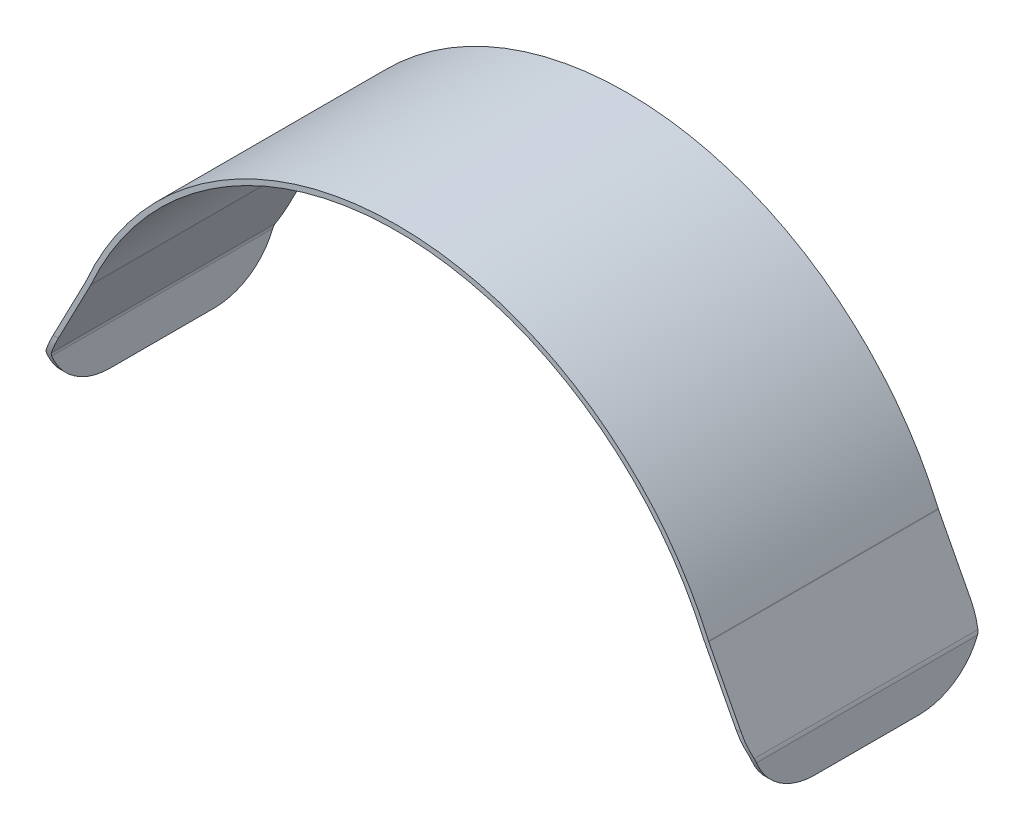
ISO-10303-21;
HEADER;
FILE_DESCRIPTION(('STEP AP214'),'2;1');
FILE_NAME('part.step','',(''),(''),'','','');
FILE_SCHEMA(('AUTOMOTIVE_DESIGN { 1 0 10303 214 1 1 1 1 }'));
ENDSEC;
DATA;
#1=APPLICATION_CONTEXT('core data for automotive mechanical design processes');
#2=APPLICATION_PROTOCOL_DEFINITION('international standard','automotive_design',2000,#1);
#3=PRODUCT_CONTEXT('',#1,'mechanical');
#4=PRODUCT('Part','Part','',(#3));
#5=PRODUCT_RELATED_PRODUCT_CATEGORY('part','',(#4));
#6=PRODUCT_DEFINITION_FORMATION('','',#4);
#7=PRODUCT_DEFINITION_CONTEXT('part definition',#1,'design');
#8=PRODUCT_DEFINITION('design','',#6,#7);
#9=PRODUCT_DEFINITION_SHAPE('','',#8);
#10=(LENGTH_UNIT() NAMED_UNIT(*) SI_UNIT(.MILLI.,.METRE.));
#11=(NAMED_UNIT(*) PLANE_ANGLE_UNIT() SI_UNIT($,.RADIAN.));
#12=(NAMED_UNIT(*) SI_UNIT($,.STERADIAN.) SOLID_ANGLE_UNIT());
#13=UNCERTAINTY_MEASURE_WITH_UNIT(LENGTH_MEASURE(1.E-05),#10,'distance_accuracy_value','');
#14=(GEOMETRIC_REPRESENTATION_CONTEXT(3) GLOBAL_UNCERTAINTY_ASSIGNED_CONTEXT((#13)) GLOBAL_UNIT_ASSIGNED_CONTEXT((#10,
#11,#12)) REPRESENTATION_CONTEXT('',''));
#15=CARTESIAN_POINT('',(0.,0.,0.));
#16=DIRECTION('',(0.,0.,1.));
#17=DIRECTION('',(1.,0.,0.));
#18=AXIS2_PLACEMENT_3D('',#15,#16,#17);
#19=CARTESIAN_POINT('',(-212.725,0.,69.85));
#20=DIRECTION('',(-1.,0.,0.));
#21=DIRECTION('',(0.,0.,1.));
#22=AXIS2_PLACEMENT_3D('',#19,#20,#21);
#23=PLANE('',#22);
#24=CARTESIAN_POINT('',(-212.725,38.1,-31.75));
#25=DIRECTION('',(-1.,0.,0.));
#26=DIRECTION('',(0.,0.,1.));
#27=AXIS2_PLACEMENT_3D('',#24,#25,#26);
#28=CIRCLE('',#27,38.1);
#29=CARTESIAN_POINT('',(-212.725,0.,-31.75));
#30=VERTEX_POINT('',#29);
#31=CARTESIAN_POINT('',(-212.725,24.1569319083965,-67.2070282481895));
#32=VERTEX_POINT('',#31);
#33=EDGE_CURVE('E266',#30,#32,#28,.F.);
#34=ORIENTED_EDGE('',*,*,#33,.T.);
#35=DIRECTION('',(0.,0.,-1.));
#36=VECTOR('',#35,1.);
#37=CARTESIAN_POINT('',(-212.725,24.1569319083965,67.6710244842766));
#38=LINE('',#37,#36);
#39=CARTESIAN_POINT('',(-212.725,24.1569319083965,67.2070282481895));
#40=VERTEX_POINT('',#39);
#41=EDGE_CURVE('E391',#32,#40,#38,.F.);
#42=ORIENTED_EDGE('',*,*,#41,.T.);
#43=CARTESIAN_POINT('',(-212.725,38.1,31.75));
#44=DIRECTION('',(-1.,0.,0.));
#45=DIRECTION('',(0.,0.,1.));
#46=AXIS2_PLACEMENT_3D('',#43,#44,#45);
#47=CIRCLE('',#46,38.1);
#48=CARTESIAN_POINT('',(-212.725,0.,31.75));
#49=VERTEX_POINT('',#48);
#50=EDGE_CURVE('E253',#40,#49,#47,.F.);
#51=ORIENTED_EDGE('',*,*,#50,.T.);
#52=DIRECTION('',(0.,0.,-1.));
#53=VECTOR('',#52,1.);
#54=CARTESIAN_POINT('',(-212.725,0.,69.85));
#55=LINE('',#54,#53);
#56=EDGE_CURVE('E435',#49,#30,#55,.T.);
#57=ORIENTED_EDGE('',*,*,#56,.T.);
#58=EDGE_LOOP('',(#34,#42,#51,#57));
#59=FACE_BOUND('',#58,.T.);
#60=ADVANCED_FACE('F33',(#59),#23,.F.);
#61=CARTESIAN_POINT('',(-212.725,25.4,69.85));
#62=DIRECTION('',(-0.887010833178223,0.461748613235032,0.));
#63=DIRECTION('',(-0.461748613235032,-0.887010833178223,0.));
#64=AXIS2_PLACEMENT_3D('',#61,#62,#63);
#65=PLANE('',#64);
#66=DIRECTION('',(0.461748613235032,0.887010833178223,0.));
#67=VECTOR('',#66,1.);
#68=CARTESIAN_POINT('',(-212.725,25.4,-69.85));
#69=LINE('',#68,#67);
#70=CARTESIAN_POINT('',(-206.113798457993,38.1,-69.85));
#71=VERTEX_POINT('',#70);
#72=CARTESIAN_POINT('',(-186.35550377433,76.0553309467451,-69.85));
#73=VERTEX_POINT('',#72);
#74=EDGE_CURVE('E414',#71,#73,#69,.T.);
#75=ORIENTED_EDGE('',*,*,#74,.T.);
#76=DIRECTION('',(0.,0.,-1.));
#77=VECTOR('',#76,1.);
#78=CARTESIAN_POINT('',(-186.35550377433,76.0553309467451,69.85));
#79=LINE('',#78,#77);
#80=CARTESIAN_POINT('',(-186.35550377433,76.0553309467451,69.85));
#81=VERTEX_POINT('',#80);
#82=EDGE_CURVE('E461',#73,#81,#79,.F.);
#83=ORIENTED_EDGE('',*,*,#82,.T.);
#84=DIRECTION('',(0.461748613235032,0.887010833178223,0.));
#85=VECTOR('',#84,1.);
#86=CARTESIAN_POINT('',(-212.725,25.4,69.85));
#87=LINE('',#86,#85);
#88=CARTESIAN_POINT('',(-206.113798457993,38.1,69.85));
#89=VERTEX_POINT('',#88);
#90=EDGE_CURVE('E434',#89,#81,#87,.T.);
#91=ORIENTED_EDGE('',*,*,#90,.F.);
#92=CARTESIAN_POINT('',(-206.113798457993,38.1,31.75));
#93=DIRECTION('',(-0.887010833178223,0.461748613235032,0.));
#94=DIRECTION('',(0.461748613235032,0.887010833178223,0.));
#95=AXIS2_PLACEMENT_3D('',#92,#93,#94);
#96=ELLIPSE('',#95,42.9532521756076,38.1);
#97=CARTESIAN_POINT('',(-212.151015032545,26.5026148636304,68.0420192053117));
#98=VERTEX_POINT('',#97);
#99=EDGE_CURVE('E250',#89,#98,#96,.F.);
#100=ORIENTED_EDGE('',*,*,#99,.T.);
#101=DIRECTION('',(0.,0.,-1.));
#102=VECTOR('',#101,1.);
#103=CARTESIAN_POINT('',(-212.151015032545,26.5026148636305,-67.6710244842766));
#104=LINE('',#103,#102);
#105=CARTESIAN_POINT('',(-212.151015032545,26.5026148636305,-68.0420192053117));
#106=VERTEX_POINT('',#105);
#107=EDGE_CURVE('E310',#98,#106,#104,.T.);
#108=ORIENTED_EDGE('',*,*,#107,.T.);
#109=CARTESIAN_POINT('',(-206.113798457993,38.1,-31.75));
#110=DIRECTION('',(-0.887010833178223,0.461748613235032,0.));
#111=DIRECTION('',(-0.461748613235032,-0.887010833178223,0.));
#112=AXIS2_PLACEMENT_3D('',#109,#110,#111);
#113=ELLIPSE('',#112,42.9532521756076,38.1);
#114=EDGE_CURVE('E269',#106,#71,#113,.F.);
#115=ORIENTED_EDGE('',*,*,#114,.T.);
#116=EDGE_LOOP('',(#75,#83,#91,#100,#108,#115));
#117=FACE_BOUND('',#116,.T.);
#118=ADVANCED_FACE('F401',(#117),#65,.F.);
#119=CARTESIAN_POINT('',(0.,-5.9570461695976,69.85));
#120=DIRECTION('',(0.,0.,-1.));
#121=DIRECTION('',(-1.,0.,0.));
#122=AXIS2_PLACEMENT_3D('',#119,#120,#121);
#123=CYLINDRICAL_SURFACE('',#122,203.592953830407);
#124=CARTESIAN_POINT('',(0.,-5.9570461695976,-69.85));
#125=DIRECTION('',(0.,0.,-1.));
#126=DIRECTION('',(-1.,0.,0.));
#127=AXIS2_PLACEMENT_3D('',#124,#125,#126);
#128=CIRCLE('',#127,203.592953830407);
#129=CARTESIAN_POINT('',(-186.215125981446,76.3473747633301,-69.85));
#130=VERTEX_POINT('',#129);
#131=CARTESIAN_POINT('',(186.215125981446,76.3473747633299,-69.85));
#132=VERTEX_POINT('',#131);
#133=EDGE_CURVE('E418',#130,#132,#128,.T.);
#134=ORIENTED_EDGE('',*,*,#133,.T.);
#135=DIRECTION('',(0.,0.,-1.));
#136=VECTOR('',#135,1.);
#137=CARTESIAN_POINT('',(186.215125981446,76.34737476333,69.85));
#138=LINE('',#137,#136);
#139=CARTESIAN_POINT('',(186.215125981446,76.3473747633299,69.85));
#140=VERTEX_POINT('',#139);
#141=EDGE_CURVE('E482',#132,#140,#138,.F.);
#142=ORIENTED_EDGE('',*,*,#141,.T.);
#143=CARTESIAN_POINT('',(0.,-5.9570461695976,69.85));
#144=DIRECTION('',(0.,0.,-1.));
#145=DIRECTION('',(-1.,0.,0.));
#146=AXIS2_PLACEMENT_3D('',#143,#144,#145);
#147=CIRCLE('',#146,203.592953830407);
#148=CARTESIAN_POINT('',(-186.215125981446,76.3473747633301,69.85));
#149=VERTEX_POINT('',#148);
#150=EDGE_CURVE('E551',#149,#140,#147,.T.);
#151=ORIENTED_EDGE('',*,*,#150,.F.);
#152=DIRECTION('',(0.,0.,-1.));
#153=VECTOR('',#152,1.);
#154=CARTESIAN_POINT('',(-186.215125981446,76.3473747633301,69.85));
#155=LINE('',#154,#153);
#156=EDGE_CURVE('E484',#149,#130,#155,.T.);
#157=ORIENTED_EDGE('',*,*,#156,.T.);
#158=EDGE_LOOP('',(#134,#142,#151,#157));
#159=FACE_BOUND('',#158,.T.);
#160=ADVANCED_FACE('F518',(#159),#123,.F.);
#161=CARTESIAN_POINT('',(212.725,25.4,69.85));
#162=DIRECTION('',(0.887010833178223,0.461748613235032,0.));
#163=DIRECTION('',(-0.461748613235032,0.887010833178223,0.));
#164=AXIS2_PLACEMENT_3D('',#161,#162,#163);
#165=PLANE('',#164);
#166=DIRECTION('',(0.461748613235032,-0.887010833178223,0.));
#167=VECTOR('',#166,1.);
#168=CARTESIAN_POINT('',(212.725,25.4,69.85));
#169=LINE('',#168,#167);
#170=CARTESIAN_POINT('',(186.355503774331,76.0553309467449,69.85));
#171=VERTEX_POINT('',#170);
#172=CARTESIAN_POINT('',(206.113798457993,38.1,69.85));
#173=VERTEX_POINT('',#172);
#174=EDGE_CURVE('E556',#171,#173,#169,.T.);
#175=ORIENTED_EDGE('',*,*,#174,.F.);
#176=DIRECTION('',(0.,0.,-1.));
#177=VECTOR('',#176,1.);
#178=CARTESIAN_POINT('',(186.355503774331,76.0553309467449,69.85));
#179=LINE('',#178,#177);
#180=CARTESIAN_POINT('',(186.355503774331,76.0553309467449,-69.85));
#181=VERTEX_POINT('',#180);
#182=EDGE_CURVE('E489',#171,#181,#179,.T.);
#183=ORIENTED_EDGE('',*,*,#182,.T.);
#184=DIRECTION('',(0.461748613235032,-0.887010833178223,0.));
#185=VECTOR('',#184,1.);
#186=CARTESIAN_POINT('',(212.725,25.4,-69.85));
#187=LINE('',#186,#185);
#188=CARTESIAN_POINT('',(206.113798457993,38.1,-69.85));
#189=VERTEX_POINT('',#188);
#190=EDGE_CURVE('E421',#181,#189,#187,.T.);
#191=ORIENTED_EDGE('',*,*,#190,.T.);
#192=CARTESIAN_POINT('',(206.113798457993,38.1,-31.75));
#193=DIRECTION('',(0.887010833178223,0.461748613235032,0.));
#194=DIRECTION('',(-0.461748613235032,0.887010833178223,0.));
#195=AXIS2_PLACEMENT_3D('',#192,#193,#194);
#196=ELLIPSE('',#195,42.9532521756076,38.1);
#197=CARTESIAN_POINT('',(212.151015032545,26.5026148636304,-68.0420192053117));
#198=VERTEX_POINT('',#197);
#199=EDGE_CURVE('E227',#189,#198,#196,.F.);
#200=ORIENTED_EDGE('',*,*,#199,.T.);
#201=DIRECTION('',(0.,0.,-1.));
#202=VECTOR('',#201,1.);
#203=CARTESIAN_POINT('',(212.151015032545,26.5026148636305,67.6710244842766));
#204=LINE('',#203,#202);
#205=CARTESIAN_POINT('',(212.151015032545,26.5026148636305,68.0420192053117));
#206=VERTEX_POINT('',#205);
#207=EDGE_CURVE('E385',#198,#206,#204,.F.);
#208=ORIENTED_EDGE('',*,*,#207,.T.);
#209=CARTESIAN_POINT('',(206.113798457993,38.1,31.75));
#210=DIRECTION('',(0.887010833178223,0.461748613235032,0.));
#211=DIRECTION('',(0.461748613235032,-0.887010833178223,0.));
#212=AXIS2_PLACEMENT_3D('',#209,#210,#211);
#213=ELLIPSE('',#212,42.9532521756076,38.1);
#214=EDGE_CURVE('E244',#206,#173,#213,.F.);
#215=ORIENTED_EDGE('',*,*,#214,.T.);
#216=EDGE_LOOP('',(#175,#183,#191,#200,#208,#215));
#217=FACE_BOUND('',#216,.T.);
#218=ADVANCED_FACE('F501',(#217),#165,.F.);
#219=CARTESIAN_POINT('',(212.725,0.,69.85));
#220=DIRECTION('',(1.,0.,0.));
#221=DIRECTION('',(0.,0.,-1.));
#222=AXIS2_PLACEMENT_3D('',#219,#220,#221);
#223=PLANE('',#222);
#224=CARTESIAN_POINT('',(212.725,38.1,31.75));
#225=DIRECTION('',(1.,0.,0.));
#226=DIRECTION('',(0.,0.,-1.));
#227=AXIS2_PLACEMENT_3D('',#224,#225,#226);
#228=CIRCLE('',#227,38.1);
#229=CARTESIAN_POINT('',(212.725,0.,31.75));
#230=VERTEX_POINT('',#229);
#231=CARTESIAN_POINT('',(212.725,24.1569319083965,67.2070282481895));
#232=VERTEX_POINT('',#231);
#233=EDGE_CURVE('E241',#230,#232,#228,.F.);
#234=ORIENTED_EDGE('',*,*,#233,.T.);
#235=DIRECTION('',(0.,0.,-1.));
#236=VECTOR('',#235,1.);
#237=CARTESIAN_POINT('',(212.725,24.1569319083965,-67.6710244842766));
#238=LINE('',#237,#236);
#239=CARTESIAN_POINT('',(212.725,24.1569319083965,-67.2070282481895));
#240=VERTEX_POINT('',#239);
#241=EDGE_CURVE('E386',#232,#240,#238,.T.);
#242=ORIENTED_EDGE('',*,*,#241,.T.);
#243=CARTESIAN_POINT('',(212.725,38.1,-31.75));
#244=DIRECTION('',(1.,0.,0.));
#245=DIRECTION('',(0.,0.,-1.));
#246=AXIS2_PLACEMENT_3D('',#243,#244,#245);
#247=CIRCLE('',#246,38.1);
#248=CARTESIAN_POINT('',(212.725,0.,-31.75));
#249=VERTEX_POINT('',#248);
#250=EDGE_CURVE('E230',#240,#249,#247,.F.);
#251=ORIENTED_EDGE('',*,*,#250,.T.);
#252=DIRECTION('',(0.,0.,-1.));
#253=VECTOR('',#252,1.);
#254=CARTESIAN_POINT('',(212.725,0.,69.85));
#255=LINE('',#254,#253);
#256=EDGE_CURVE('E205',#230,#249,#255,.T.);
#257=ORIENTED_EDGE('',*,*,#256,.F.);
#258=EDGE_LOOP('',(#234,#242,#251,#257));
#259=FACE_BOUND('',#258,.T.);
#260=ADVANCED_FACE('F498',(#259),#223,.F.);
#261=CARTESIAN_POINT('',(212.725,0.,69.85));
#262=DIRECTION('',(0.,1.,0.));
#263=DIRECTION('',(0.,0.,1.));
#264=AXIS2_PLACEMENT_3D('',#261,#262,#263);
#265=PLANE('',#264);
#266=DIRECTION('',(0.,0.,-1.));
#267=VECTOR('',#266,1.);
#268=CARTESIAN_POINT('',(215.9,0.,69.85));
#269=LINE('',#268,#267);
#270=CARTESIAN_POINT('',(215.9,0.,31.75));
#271=VERTEX_POINT('',#270);
#272=CARTESIAN_POINT('',(215.9,0.,-31.75));
#273=VERTEX_POINT('',#272);
#274=EDGE_CURVE('E195',#271,#273,#269,.T.);
#275=ORIENTED_EDGE('',*,*,#274,.F.);
#276=DIRECTION('',(1.,0.,0.));
#277=VECTOR('',#276,1.);
#278=CARTESIAN_POINT('',(212.725,0.,31.75));
#279=LINE('',#278,#277);
#280=EDGE_CURVE('E239',#271,#230,#279,.F.);
#281=ORIENTED_EDGE('',*,*,#280,.T.);
#282=ORIENTED_EDGE('',*,*,#256,.T.);
#283=DIRECTION('',(1.,0.,0.));
#284=VECTOR('',#283,1.);
#285=CARTESIAN_POINT('',(215.9,0.,-31.75));
#286=LINE('',#285,#284);
#287=EDGE_CURVE('E213',#249,#273,#286,.T.);
#288=ORIENTED_EDGE('',*,*,#287,.T.);
#289=EDGE_LOOP('',(#275,#281,#282,#288));
#290=FACE_BOUND('',#289,.T.);
#291=ADVANCED_FACE('F218',(#290),#265,.F.);
#292=CARTESIAN_POINT('',(215.9,0.,69.85));
#293=DIRECTION('',(-1.,0.,0.));
#294=DIRECTION('',(0.,0.,1.));
#295=AXIS2_PLACEMENT_3D('',#292,#293,#294);
#296=PLANE('',#295);
#297=CARTESIAN_POINT('',(215.9,38.1,-31.75));
#298=DIRECTION('',(-1.,0.,0.));
#299=DIRECTION('',(0.,0.,1.));
#300=AXIS2_PLACEMENT_3D('',#297,#298,#299);
#301=CIRCLE('',#300,38.1);
#302=CARTESIAN_POINT('',(215.9,24.1569319083965,-67.2070282481895));
#303=VERTEX_POINT('',#302);
#304=EDGE_CURVE('E198',#273,#303,#301,.F.);
#305=ORIENTED_EDGE('',*,*,#304,.T.);
#306=DIRECTION('',(0.,0.,-1.));
#307=VECTOR('',#306,1.);
#308=CARTESIAN_POINT('',(215.9,24.1569319083965,69.85));
#309=LINE('',#308,#307);
#310=CARTESIAN_POINT('',(215.9,24.1569319083965,67.2070282481895));
#311=VERTEX_POINT('',#310);
#312=EDGE_CURVE('E363',#303,#311,#309,.F.);
#313=ORIENTED_EDGE('',*,*,#312,.T.);
#314=CARTESIAN_POINT('',(215.9,38.1,31.75));
#315=DIRECTION('',(-1.,0.,0.));
#316=DIRECTION('',(0.,0.,1.));
#317=AXIS2_PLACEMENT_3D('',#314,#315,#316);
#318=CIRCLE('',#317,38.1);
#319=EDGE_CURVE('E201',#311,#271,#318,.F.);
#320=ORIENTED_EDGE('',*,*,#319,.T.);
#321=ORIENTED_EDGE('',*,*,#274,.T.);
#322=EDGE_LOOP('',(#305,#313,#320,#321));
#323=FACE_BOUND('',#322,.T.);
#324=ADVANCED_FACE('F197',(#323),#296,.F.);
#325=CARTESIAN_POINT('',(215.9,25.4,69.85));
#326=DIRECTION('',(-0.887010833178223,-0.461748613235032,0.));
#327=DIRECTION('',(0.461748613235032,-0.887010833178223,0.));
#328=AXIS2_PLACEMENT_3D('',#325,#326,#327);
#329=PLANE('',#328);
#330=DIRECTION('',(-0.461748613235032,0.887010833178223,0.));
#331=VECTOR('',#330,1.);
#332=CARTESIAN_POINT('',(215.9,25.4,-69.85));
#333=LINE('',#332,#331);
#334=CARTESIAN_POINT('',(209.288798457993,38.1,-69.85));
#335=VERTEX_POINT('',#334);
#336=CARTESIAN_POINT('',(189.540040041054,76.0370119488119,-69.85));
#337=VERTEX_POINT('',#336);
#338=EDGE_CURVE('E428',#335,#337,#333,.T.);
#339=ORIENTED_EDGE('',*,*,#338,.T.);
#340=DIRECTION('',(0.,0.,1.));
#341=VECTOR('',#340,1.);
#342=CARTESIAN_POINT('',(189.540040041054,76.0370119488119,69.85));
#343=LINE('',#342,#341);
#344=CARTESIAN_POINT('',(189.540040041054,76.0370119488119,69.85));
#345=VERTEX_POINT('',#344);
#346=EDGE_CURVE('E462',#337,#345,#343,.T.);
#347=ORIENTED_EDGE('',*,*,#346,.T.);
#348=DIRECTION('',(-0.461748613235032,0.887010833178223,0.));
#349=VECTOR('',#348,1.);
#350=CARTESIAN_POINT('',(215.9,25.4,69.85));
#351=LINE('',#350,#349);
#352=CARTESIAN_POINT('',(209.288798457993,38.1,69.85));
#353=VERTEX_POINT('',#352);
#354=EDGE_CURVE('E563',#353,#345,#351,.T.);
#355=ORIENTED_EDGE('',*,*,#354,.F.);
#356=CARTESIAN_POINT('',(209.288798457993,38.1,31.75));
#357=DIRECTION('',(-0.887010833178223,-0.461748613235032,0.));
#358=DIRECTION('',(0.461748613235032,-0.887010833178223,0.));
#359=AXIS2_PLACEMENT_3D('',#356,#357,#358);
#360=ELLIPSE('',#359,42.9532521756076,38.1);
#361=CARTESIAN_POINT('',(215.326015032545,26.5026148636305,68.0420192053117));
#362=VERTEX_POINT('',#361);
#363=EDGE_CURVE('E235',#353,#362,#360,.F.);
#364=ORIENTED_EDGE('',*,*,#363,.T.);
#365=DIRECTION('',(0.,0.,-1.));
#366=VECTOR('',#365,1.);
#367=CARTESIAN_POINT('',(215.326015032545,26.5026148636305,69.85));
#368=LINE('',#367,#366);
#369=CARTESIAN_POINT('',(215.326015032545,26.5026148636305,-68.0420192053117));
#370=VERTEX_POINT('',#369);
#371=EDGE_CURVE('E364',#362,#370,#368,.T.);
#372=ORIENTED_EDGE('',*,*,#371,.T.);
#373=CARTESIAN_POINT('',(209.288798457993,38.1,-31.75));
#374=DIRECTION('',(-0.887010833178223,-0.461748613235032,0.));
#375=DIRECTION('',(-0.461748613235032,0.887010833178223,0.));
#376=AXIS2_PLACEMENT_3D('',#373,#374,#375);
#377=ELLIPSE('',#376,42.9532521756076,38.1);
#378=EDGE_CURVE('E215',#370,#335,#377,.F.);
#379=ORIENTED_EDGE('',*,*,#378,.T.);
#380=EDGE_LOOP('',(#339,#347,#355,#364,#372,#379));
#381=FACE_BOUND('',#380,.T.);
#382=ADVANCED_FACE('F503',(#381),#329,.F.);
#383=CARTESIAN_POINT('',(0.,-5.5159289830972,69.85));
#384=DIRECTION('',(0.,0.,-1.));
#385=DIRECTION('',(-1.,0.,0.));
#386=AXIS2_PLACEMENT_3D('',#383,#384,#385);
#387=CYLINDRICAL_SURFACE('',#386,206.326836643904);
#388=CARTESIAN_POINT('',(0.,-5.5159289830972,69.85));
#389=DIRECTION('',(0.,0.,1.));
#390=DIRECTION('',(-1.,0.,0.));
#391=AXIS2_PLACEMENT_3D('',#388,#389,#390);
#392=CIRCLE('',#391,206.326836643904);
#393=CARTESIAN_POINT('',(189.38322592662,76.3666531519781,69.85));
#394=VERTEX_POINT('',#393);
#395=CARTESIAN_POINT('',(-189.38322592662,76.3666531519781,69.85));
#396=VERTEX_POINT('',#395);
#397=EDGE_CURVE('E564',#394,#396,#392,.T.);
#398=ORIENTED_EDGE('',*,*,#397,.F.);
#399=DIRECTION('',(0.,0.,-1.));
#400=VECTOR('',#399,1.);
#401=CARTESIAN_POINT('',(189.38322592662,76.3666531519781,69.85));
#402=LINE('',#401,#400);
#403=CARTESIAN_POINT('',(189.38322592662,76.3666531519781,-69.85));
#404=VERTEX_POINT('',#403);
#405=EDGE_CURVE('E466',#394,#404,#402,.T.);
#406=ORIENTED_EDGE('',*,*,#405,.T.);
#407=CARTESIAN_POINT('',(0.,-5.5159289830972,-69.85));
#408=DIRECTION('',(0.,0.,1.));
#409=DIRECTION('',(-1.,0.,0.));
#410=AXIS2_PLACEMENT_3D('',#407,#408,#409);
#411=CIRCLE('',#410,206.326836643904);
#412=CARTESIAN_POINT('',(-189.38322592662,76.3666531519781,-69.85));
#413=VERTEX_POINT('',#412);
#414=EDGE_CURVE('E431',#404,#413,#411,.T.);
#415=ORIENTED_EDGE('',*,*,#414,.T.);
#416=DIRECTION('',(0.,0.,-1.));
#417=VECTOR('',#416,1.);
#418=CARTESIAN_POINT('',(-189.38322592662,76.3666531519781,69.85));
#419=LINE('',#418,#417);
#420=EDGE_CURVE('E48',#413,#396,#419,.F.);
#421=ORIENTED_EDGE('',*,*,#420,.T.);
#422=EDGE_LOOP('',(#398,#406,#415,#421));
#423=FACE_BOUND('',#422,.T.);
#424=ADVANCED_FACE('F473',(#423),#387,.T.);
#425=CARTESIAN_POINT('',(-215.9,25.4,69.85));
#426=DIRECTION('',(0.887010833178223,-0.461748613235032,0.));
#427=DIRECTION('',(0.461748613235032,0.887010833178223,0.));
#428=AXIS2_PLACEMENT_3D('',#425,#426,#427);
#429=PLANE('',#428);
#430=DIRECTION('',(-0.461748613235032,-0.887010833178223,0.));
#431=VECTOR('',#430,1.);
#432=CARTESIAN_POINT('',(-215.9,25.4,69.85));
#433=LINE('',#432,#431);
#434=CARTESIAN_POINT('',(-189.540040041054,76.0370119488119,69.85));
#435=VERTEX_POINT('',#434);
#436=CARTESIAN_POINT('',(-209.288798457993,38.1,69.85));
#437=VERTEX_POINT('',#436);
#438=EDGE_CURVE('E424',#435,#437,#433,.T.);
#439=ORIENTED_EDGE('',*,*,#438,.F.);
#440=DIRECTION('',(0.,0.,1.));
#441=VECTOR('',#440,1.);
#442=CARTESIAN_POINT('',(-189.540040041054,76.0370119488119,-69.85));
#443=LINE('',#442,#441);
#444=CARTESIAN_POINT('',(-189.540040041054,76.0370119488119,-69.85));
#445=VERTEX_POINT('',#444);
#446=EDGE_CURVE('E458',#435,#445,#443,.F.);
#447=ORIENTED_EDGE('',*,*,#446,.T.);
#448=DIRECTION('',(-0.461748613235032,-0.887010833178223,0.));
#449=VECTOR('',#448,1.);
#450=CARTESIAN_POINT('',(-215.9,25.4,-69.85));
#451=LINE('',#450,#449);
#452=CARTESIAN_POINT('',(-209.288798457993,38.1,-69.85));
#453=VERTEX_POINT('',#452);
#454=EDGE_CURVE('E413',#445,#453,#451,.T.);
#455=ORIENTED_EDGE('',*,*,#454,.T.);
#456=CARTESIAN_POINT('',(-209.288798457993,38.1,-31.75));
#457=DIRECTION('',(0.887010833178223,-0.461748613235032,0.));
#458=DIRECTION('',(-0.461748613235032,-0.887010833178223,0.));
#459=AXIS2_PLACEMENT_3D('',#456,#457,#458);
#460=ELLIPSE('',#459,42.9532521756076,38.1);
#461=CARTESIAN_POINT('',(-215.326015032545,26.5026148636305,-68.0420192053117));
#462=VERTEX_POINT('',#461);
#463=EDGE_CURVE('E274',#453,#462,#460,.F.);
#464=ORIENTED_EDGE('',*,*,#463,.T.);
#465=DIRECTION('',(0.,0.,-1.));
#466=VECTOR('',#465,1.);
#467=CARTESIAN_POINT('',(-215.326015032545,26.5026148636305,69.85));
#468=LINE('',#467,#466);
#469=CARTESIAN_POINT('',(-215.326015032545,26.5026148636305,68.0420192053117));
#470=VERTEX_POINT('',#469);
#471=EDGE_CURVE('E290',#462,#470,#468,.F.);
#472=ORIENTED_EDGE('',*,*,#471,.T.);
#473=CARTESIAN_POINT('',(-209.288798457993,38.1,31.75));
#474=DIRECTION('',(0.887010833178223,-0.461748613235032,0.));
#475=DIRECTION('',(0.461748613235032,0.887010833178223,0.));
#476=AXIS2_PLACEMENT_3D('',#473,#474,#475);
#477=ELLIPSE('',#476,42.9532521756076,38.1);
#478=EDGE_CURVE('E260',#470,#437,#477,.F.);
#479=ORIENTED_EDGE('',*,*,#478,.T.);
#480=EDGE_LOOP('',(#439,#447,#455,#464,#472,#479));
#481=FACE_BOUND('',#480,.T.);
#482=ADVANCED_FACE('F455',(#481),#429,.F.);
#483=CARTESIAN_POINT('',(-215.9,0.,69.85));
#484=DIRECTION('',(1.,0.,0.));
#485=DIRECTION('',(0.,0.,-1.));
#486=AXIS2_PLACEMENT_3D('',#483,#484,#485);
#487=PLANE('',#486);
#488=CARTESIAN_POINT('',(-215.9,38.1,31.75));
#489=DIRECTION('',(1.,0.,0.));
#490=DIRECTION('',(0.,0.,-1.));
#491=AXIS2_PLACEMENT_3D('',#488,#489,#490);
#492=CIRCLE('',#491,38.1);
#493=CARTESIAN_POINT('',(-215.9,0.,31.75));
#494=VERTEX_POINT('',#493);
#495=CARTESIAN_POINT('',(-215.9,24.1569319083965,67.2070282481895));
#496=VERTEX_POINT('',#495);
#497=EDGE_CURVE('E257',#494,#496,#492,.F.);
#498=ORIENTED_EDGE('',*,*,#497,.T.);
#499=DIRECTION('',(0.,0.,-1.));
#500=VECTOR('',#499,1.);
#501=CARTESIAN_POINT('',(-215.9,24.1569319083965,69.85));
#502=LINE('',#501,#500);
#503=CARTESIAN_POINT('',(-215.9,24.1569319083965,-67.2070282481895));
#504=VERTEX_POINT('',#503);
#505=EDGE_CURVE('E279',#496,#504,#502,.T.);
#506=ORIENTED_EDGE('',*,*,#505,.T.);
#507=CARTESIAN_POINT('',(-215.9,38.1,-31.75));
#508=DIRECTION('',(1.,0.,0.));
#509=DIRECTION('',(0.,0.,-1.));
#510=AXIS2_PLACEMENT_3D('',#507,#508,#509);
#511=CIRCLE('',#510,38.1);
#512=CARTESIAN_POINT('',(-215.9,0.,-31.75));
#513=VERTEX_POINT('',#512);
#514=EDGE_CURVE('E277',#504,#513,#511,.F.);
#515=ORIENTED_EDGE('',*,*,#514,.T.);
#516=DIRECTION('',(0.,0.,-1.));
#517=VECTOR('',#516,1.);
#518=CARTESIAN_POINT('',(-215.9,0.,69.85));
#519=LINE('',#518,#517);
#520=EDGE_CURVE('E206',#494,#513,#519,.T.);
#521=ORIENTED_EDGE('',*,*,#520,.F.);
#522=EDGE_LOOP('',(#498,#506,#515,#521));
#523=FACE_BOUND('',#522,.T.);
#524=ADVANCED_FACE('F451',(#523),#487,.F.);
#525=CARTESIAN_POINT('',(-212.725,0.,69.85));
#526=DIRECTION('',(0.,1.,0.));
#527=DIRECTION('',(0.,0.,1.));
#528=AXIS2_PLACEMENT_3D('',#525,#526,#527);
#529=PLANE('',#528);
#530=ORIENTED_EDGE('',*,*,#520,.T.);
#531=DIRECTION('',(1.,0.,0.));
#532=VECTOR('',#531,1.);
#533=CARTESIAN_POINT('',(-212.725,0.,-31.75));
#534=LINE('',#533,#532);
#535=EDGE_CURVE('E263',#513,#30,#534,.T.);
#536=ORIENTED_EDGE('',*,*,#535,.T.);
#537=ORIENTED_EDGE('',*,*,#56,.F.);
#538=DIRECTION('',(1.,0.,0.));
#539=VECTOR('',#538,1.);
#540=CARTESIAN_POINT('',(-212.725,0.,31.75));
#541=LINE('',#540,#539);
#542=EDGE_CURVE('E255',#49,#494,#541,.F.);
#543=ORIENTED_EDGE('',*,*,#542,.T.);
#544=EDGE_LOOP('',(#530,#536,#537,#543));
#545=FACE_BOUND('',#544,.T.);
#546=ADVANCED_FACE('F442',(#545),#529,.F.);
#547=CARTESIAN_POINT('',(0.,-5.9570461695976,69.85));
#548=DIRECTION('',(0.,0.,-1.));
#549=DIRECTION('',(-1.,0.,0.));
#550=AXIS2_PLACEMENT_3D('',#547,#548,#549);
#551=PLANE('',#550);
#552=ORIENTED_EDGE('',*,*,#150,.T.);
#553=CARTESIAN_POINT('',(190.861518806876,78.4010139019789,69.85));
#554=DIRECTION('',(0.,0.,-1.));
#555=DIRECTION('',(-1.,0.,0.));
#556=AXIS2_PLACEMENT_3D('',#553,#554,#555);
#557=CIRCLE('',#556,5.08);
#558=EDGE_CURVE('E476',#140,#171,#557,.F.);
#559=ORIENTED_EDGE('',*,*,#558,.T.);
#560=ORIENTED_EDGE('',*,*,#174,.T.);
#561=DIRECTION('',(1.,0.,0.));
#562=VECTOR('',#561,1.);
#563=CARTESIAN_POINT('',(0.,38.1,69.85));
#564=LINE('',#563,#562);
#565=EDGE_CURVE('E232',#173,#353,#564,.T.);
#566=ORIENTED_EDGE('',*,*,#565,.T.);
#567=ORIENTED_EDGE('',*,*,#354,.T.);
#568=CARTESIAN_POINT('',(194.046055073599,78.3826949040459,69.85));
#569=DIRECTION('',(0.,0.,-1.));
#570=DIRECTION('',(-1.,0.,0.));
#571=AXIS2_PLACEMENT_3D('',#568,#569,#570);
#572=CIRCLE('',#571,5.08);
#573=EDGE_CURVE('E55',#345,#394,#572,.T.);
#574=ORIENTED_EDGE('',*,*,#573,.T.);
#575=ORIENTED_EDGE('',*,*,#397,.T.);
#576=CARTESIAN_POINT('',(-194.046055073599,78.3826949040459,69.85));
#577=DIRECTION('',(0.,0.,-1.));
#578=DIRECTION('',(-1.,0.,0.));
#579=AXIS2_PLACEMENT_3D('',#576,#577,#578);
#580=CIRCLE('',#579,5.08);
#581=EDGE_CURVE('E11',#396,#435,#580,.T.);
#582=ORIENTED_EDGE('',*,*,#581,.T.);
#583=ORIENTED_EDGE('',*,*,#438,.T.);
#584=DIRECTION('',(1.,0.,0.));
#585=VECTOR('',#584,1.);
#586=CARTESIAN_POINT('',(0.,38.1,69.85));
#587=LINE('',#586,#585);
#588=EDGE_CURVE('E247',#437,#89,#587,.T.);
#589=ORIENTED_EDGE('',*,*,#588,.T.);
#590=ORIENTED_EDGE('',*,*,#90,.T.);
#591=CARTESIAN_POINT('',(-190.861518806876,78.4010139019791,69.85));
#592=DIRECTION('',(0.,0.,-1.));
#593=DIRECTION('',(-1.,0.,0.));
#594=AXIS2_PLACEMENT_3D('',#591,#592,#593);
#595=CIRCLE('',#594,5.08);
#596=EDGE_CURVE('E478',#81,#149,#595,.F.);
#597=ORIENTED_EDGE('',*,*,#596,.T.);
#598=EDGE_LOOP('',(#552,#559,#560,#566,#567,#574,#575,#582,#583,#589,#590,#597));
#599=FACE_BOUND('',#598,.T.);
#600=ADVANCED_FACE('F543',(#599),#551,.F.);
#601=CARTESIAN_POINT('',(0.,-5.9570461695976,-69.85));
#602=DIRECTION('',(0.,0.,-1.));
#603=DIRECTION('',(-1.,0.,0.));
#604=AXIS2_PLACEMENT_3D('',#601,#602,#603);
#605=PLANE('',#604);
#606=ORIENTED_EDGE('',*,*,#190,.F.);
#607=CARTESIAN_POINT('',(190.861518806876,78.4010139019789,-69.85));
#608=DIRECTION('',(0.,0.,-1.));
#609=DIRECTION('',(-1.,0.,0.));
#610=AXIS2_PLACEMENT_3D('',#607,#608,#609);
#611=CIRCLE('',#610,5.08);
#612=EDGE_CURVE('E487',#181,#132,#611,.T.);
#613=ORIENTED_EDGE('',*,*,#612,.T.);
#614=ORIENTED_EDGE('',*,*,#133,.F.);
#615=CARTESIAN_POINT('',(-190.861518806876,78.4010139019791,-69.85));
#616=DIRECTION('',(0.,0.,-1.));
#617=DIRECTION('',(-1.,0.,0.));
#618=AXIS2_PLACEMENT_3D('',#615,#616,#617);
#619=CIRCLE('',#618,5.08);
#620=EDGE_CURVE('E416',#130,#73,#619,.T.);
#621=ORIENTED_EDGE('',*,*,#620,.T.);
#622=ORIENTED_EDGE('',*,*,#74,.F.);
#623=DIRECTION('',(1.,0.,0.));
#624=VECTOR('',#623,1.);
#625=CARTESIAN_POINT('',(-215.9,38.1,-69.85));
#626=LINE('',#625,#624);
#627=EDGE_CURVE('E271',#71,#453,#626,.F.);
#628=ORIENTED_EDGE('',*,*,#627,.T.);
#629=ORIENTED_EDGE('',*,*,#454,.F.);
#630=CARTESIAN_POINT('',(-194.046055073599,78.3826949040459,-69.85));
#631=DIRECTION('',(0.,0.,-1.));
#632=DIRECTION('',(-1.,0.,0.));
#633=AXIS2_PLACEMENT_3D('',#630,#631,#632);
#634=CIRCLE('',#633,5.08);
#635=EDGE_CURVE('E41',#445,#413,#634,.F.);
#636=ORIENTED_EDGE('',*,*,#635,.T.);
#637=ORIENTED_EDGE('',*,*,#414,.F.);
#638=CARTESIAN_POINT('',(194.046055073599,78.3826949040459,-69.85));
#639=DIRECTION('',(0.,0.,-1.));
#640=DIRECTION('',(-1.,0.,0.));
#641=AXIS2_PLACEMENT_3D('',#638,#639,#640);
#642=CIRCLE('',#641,5.08);
#643=EDGE_CURVE('E464',#404,#337,#642,.F.);
#644=ORIENTED_EDGE('',*,*,#643,.T.);
#645=ORIENTED_EDGE('',*,*,#338,.F.);
#646=DIRECTION('',(1.,0.,0.));
#647=VECTOR('',#646,1.);
#648=CARTESIAN_POINT('',(212.725,38.1,-69.85));
#649=LINE('',#648,#647);
#650=EDGE_CURVE('E224',#335,#189,#649,.F.);
#651=ORIENTED_EDGE('',*,*,#650,.T.);
#652=EDGE_LOOP('',(#606,#613,#614,#621,#622,#628,#629,#636,#637,#644,#645,#651));
#653=FACE_BOUND('',#652,.T.);
#654=ADVANCED_FACE('F353',(#653),#605,.T.);
#655=CARTESIAN_POINT('',(212.725,38.1,-31.75));
#656=DIRECTION('',(-1.,0.,0.));
#657=DIRECTION('',(0.,0.,1.));
#658=AXIS2_PLACEMENT_3D('',#655,#656,#657);
#659=CYLINDRICAL_SURFACE('',#658,38.1);
#660=ORIENTED_EDGE('',*,*,#378,.F.);
#661=CARTESIAN_POINT('',(215.326015032545,26.5026148636305,-68.0420192053117));
#662=CARTESIAN_POINT('',(215.396003430356,26.36820837183,-67.9990779632169));
#663=CARTESIAN_POINT('',(215.459712621654,26.2311028728275,-67.9544331758605));
#664=CARTESIAN_POINT('',(215.574397287672,25.9526832952995,-67.8619651938165));
#665=CARTESIAN_POINT('',(215.625371702996,25.8113688677305,-67.8141417351166));
#666=CARTESIAN_POINT('',(215.713561678949,25.5284325730577,-67.7164804596122));
#667=CARTESIAN_POINT('',(215.75101822738,25.386866592426,-67.6666975242459));
#668=CARTESIAN_POINT('',(215.81344862582,25.1019817507475,-67.5645835217397));
#669=CARTESIAN_POINT('',(215.838427971608,24.9586636899806,-67.512253587632));
#670=CARTESIAN_POINT('',(215.871455004389,24.7058553539147,-67.418199369498));
#671=CARTESIAN_POINT('',(215.882130327276,24.5965217895479,-67.3769523401381));
#672=CARTESIAN_POINT('',(215.896429902514,24.3770367831361,-67.2929913766267));
#673=CARTESIAN_POINT('',(215.90000210687,24.2668851976491,-67.2502689313695));
#674=CARTESIAN_POINT('',(215.9,24.1569319083965,-67.2070282481895));
#675=B_SPLINE_CURVE_WITH_KNOTS('',3,(#661,#662,#663,#664,#665,#666,#667,#668,#669,#670,#671,
#672,#673,#674),.UNSPECIFIED.,.F.,.F.,(4,2,2,2,2,2,4),(0.,0.472324305772294,0.944687890719057,
1.40815756713865,1.87142292062291,2.22323680130751,2.57761923039867),.UNSPECIFIED.);
#676=EDGE_CURVE('E214',#370,#303,#675,.T.);
#677=ORIENTED_EDGE('',*,*,#676,.T.);
#678=ORIENTED_EDGE('',*,*,#304,.F.);
#679=ORIENTED_EDGE('',*,*,#287,.F.);
#680=ORIENTED_EDGE('',*,*,#250,.F.);
#681=CARTESIAN_POINT('',(212.725,24.1569319083965,-67.2070282481895));
#682=CARTESIAN_POINT('',(212.725012688982,24.3034718552459,-67.2646637796667));
#683=CARTESIAN_POINT('',(212.71865941121,24.450393942169,-67.3213801966133));
#684=CARTESIAN_POINT('',(212.693107320252,24.7440595619867,-67.4326755347537));
#685=CARTESIAN_POINT('',(212.673898498892,24.8908028664592,-67.4872527554914));
#686=CARTESIAN_POINT('',(212.623021102128,25.1800948384921,-67.5928423847686));
#687=CARTESIAN_POINT('',(212.591602182767,25.3226695729834,-67.6439034873454));
#688=CARTESIAN_POINT('',(212.516323476164,25.6053739953978,-67.7432874311338));
#689=CARTESIAN_POINT('',(212.472471952441,25.7455052419705,-67.7916120656701));
#690=CARTESIAN_POINT('',(212.384464761661,25.9889689266665,-67.8740257435448));
#691=CARTESIAN_POINT('',(212.342922299285,26.093040992987,-67.9087417894273));
#692=CARTESIAN_POINT('',(212.252468391719,26.299462911613,-67.9766374738255));
#693=CARTESIAN_POINT('',(212.203504029422,26.4017939998304,-68.0098036406253));
#694=CARTESIAN_POINT('',(212.151015032545,26.5026148636304,-68.0420192053117));
#695=B_SPLINE_CURVE_WITH_KNOTS('',3,(#681,#682,#683,#684,#685,#686,#687,#688,#689,#690,#691,
#692,#693,#694),.UNSPECIFIED.,.F.,.F.,(4,2,2,2,2,2,4),(0.,0.472299627914168,0.944967374397079,
1.40844004818993,1.87160538713235,2.22329993646207,2.57763149103639),.UNSPECIFIED.);
#696=EDGE_CURVE('E329',#240,#198,#695,.T.);
#697=ORIENTED_EDGE('',*,*,#696,.T.);
#698=ORIENTED_EDGE('',*,*,#199,.F.);
#699=ORIENTED_EDGE('',*,*,#650,.F.);
#700=EDGE_LOOP('',(#660,#677,#678,#679,#680,#697,#698,#699));
#701=FACE_BOUND('',#700,.T.);
#702=ADVANCED_FACE('F211',(#701),#659,.T.);
#703=CARTESIAN_POINT('',(0.,38.1,31.75));
#704=DIRECTION('',(1.,0.,0.));
#705=DIRECTION('',(0.,0.,-1.));
#706=AXIS2_PLACEMENT_3D('',#703,#704,#705);
#707=CYLINDRICAL_SURFACE('',#706,38.1);
#708=ORIENTED_EDGE('',*,*,#319,.F.);
#709=CARTESIAN_POINT('',(215.9,24.1569319083965,67.2070282481895));
#710=CARTESIAN_POINT('',(215.900012688982,24.3034718552459,67.2646637796667));
#711=CARTESIAN_POINT('',(215.89365941121,24.4503939421691,67.3213801966133));
#712=CARTESIAN_POINT('',(215.868107320252,24.7440595619867,67.4326755347537));
#713=CARTESIAN_POINT('',(215.848898498892,24.8908028664592,67.4872527554914));
#714=CARTESIAN_POINT('',(215.798021102128,25.1800948384921,67.5928423847686));
#715=CARTESIAN_POINT('',(215.766602182767,25.3226695729835,67.6439034873454));
#716=CARTESIAN_POINT('',(215.691323476164,25.6053739953978,67.7432874311338));
#717=CARTESIAN_POINT('',(215.647471952441,25.7455052419705,67.7916120656701));
#718=CARTESIAN_POINT('',(215.559464761661,25.9889689266665,67.8740257435448));
#719=CARTESIAN_POINT('',(215.517922299286,26.093040992987,67.9087417894273));
#720=CARTESIAN_POINT('',(215.427468391719,26.299462911613,67.9766374738255));
#721=CARTESIAN_POINT('',(215.378504029422,26.4017939998304,68.0098036406253));
#722=CARTESIAN_POINT('',(215.326015032545,26.5026148636304,68.0420192053117));
#723=B_SPLINE_CURVE_WITH_KNOTS('',3,(#709,#710,#711,#712,#713,#714,#715,#716,#717,#718,#719,
#720,#721,#722),.UNSPECIFIED.,.F.,.F.,(4,2,2,2,2,2,4),(0.,0.472299627914185,0.944967374397089,
1.40844004818993,1.87160538713235,2.22329993646206,2.57763149103637),.UNSPECIFIED.);
#724=EDGE_CURVE('E374',#311,#362,#723,.T.);
#725=ORIENTED_EDGE('',*,*,#724,.T.);
#726=ORIENTED_EDGE('',*,*,#363,.F.);
#727=ORIENTED_EDGE('',*,*,#565,.F.);
#728=ORIENTED_EDGE('',*,*,#214,.F.);
#729=CARTESIAN_POINT('',(212.151015032545,26.5026148636305,68.0420192053117));
#730=CARTESIAN_POINT('',(212.221003430356,26.36820837183,67.9990779632168));
#731=CARTESIAN_POINT('',(212.284712621654,26.2311028728275,67.9544331758605));
#732=CARTESIAN_POINT('',(212.399397287672,25.9526832952995,67.8619651938164));
#733=CARTESIAN_POINT('',(212.450371702996,25.8113688677305,67.8141417351166));
#734=CARTESIAN_POINT('',(212.538561678949,25.5284325730577,67.7164804596122));
#735=CARTESIAN_POINT('',(212.57601822738,25.386866592426,67.6666975242459));
#736=CARTESIAN_POINT('',(212.63844862582,25.1019817507475,67.5645835217397));
#737=CARTESIAN_POINT('',(212.663427971608,24.9586636899806,67.512253587632));
#738=CARTESIAN_POINT('',(212.696455004389,24.7058553539147,67.418199369498));
#739=CARTESIAN_POINT('',(212.707130327276,24.5965217895479,67.3769523401381));
#740=CARTESIAN_POINT('',(212.721429902514,24.3770367831361,67.2929913766266));
#741=CARTESIAN_POINT('',(212.72500210687,24.2668851976491,67.2502689313695));
#742=CARTESIAN_POINT('',(212.725,24.1569319083965,67.2070282481895));
#743=B_SPLINE_CURVE_WITH_KNOTS('',3,(#729,#730,#731,#732,#733,#734,#735,#736,#737,#738,#739,
#740,#741,#742),.UNSPECIFIED.,.F.,.F.,(4,2,2,2,2,2,4),(0.,0.472324305772301,0.944687890719055,
1.40815756713865,1.87142292062292,2.22323680130751,2.57761923039866),.UNSPECIFIED.);
#744=EDGE_CURVE('E341',#206,#232,#743,.T.);
#745=ORIENTED_EDGE('',*,*,#744,.T.);
#746=ORIENTED_EDGE('',*,*,#233,.F.);
#747=ORIENTED_EDGE('',*,*,#280,.F.);
#748=EDGE_LOOP('',(#708,#725,#726,#727,#728,#745,#746,#747));
#749=FACE_BOUND('',#748,.T.);
#750=ADVANCED_FACE('F316',(#749),#707,.T.);
#751=CARTESIAN_POINT('',(0.,38.1,31.75));
#752=DIRECTION('',(1.,0.,0.));
#753=DIRECTION('',(0.,0.,-1.));
#754=AXIS2_PLACEMENT_3D('',#751,#752,#753);
#755=CYLINDRICAL_SURFACE('',#754,38.1);
#756=ORIENTED_EDGE('',*,*,#478,.F.);
#757=CARTESIAN_POINT('',(-215.326015032545,26.5026148636305,68.0420192053117));
#758=CARTESIAN_POINT('',(-215.396003430356,26.36820837183,67.9990779632168));
#759=CARTESIAN_POINT('',(-215.459712621654,26.2311028728275,67.9544331758605));
#760=CARTESIAN_POINT('',(-215.574397287672,25.9526832952995,67.8619651938165));
#761=CARTESIAN_POINT('',(-215.625371702996,25.8113688677305,67.8141417351166));
#762=CARTESIAN_POINT('',(-215.713561678949,25.5284325730577,67.7164804596121));
#763=CARTESIAN_POINT('',(-215.75101822738,25.386866592426,67.6666975242458));
#764=CARTESIAN_POINT('',(-215.81344862582,25.1019817507475,67.5645835217397));
#765=CARTESIAN_POINT('',(-215.838427971608,24.9586636899806,67.512253587632));
#766=CARTESIAN_POINT('',(-215.871455004389,24.7058553539147,67.418199369498));
#767=CARTESIAN_POINT('',(-215.882130327276,24.5965217895479,67.3769523401381));
#768=CARTESIAN_POINT('',(-215.896429902514,24.3770367831361,67.2929913766266));
#769=CARTESIAN_POINT('',(-215.90000210687,24.2668851976491,67.2502689313695));
#770=CARTESIAN_POINT('',(-215.9,24.1569319083965,67.2070282481895));
#771=B_SPLINE_CURVE_WITH_KNOTS('',3,(#757,#758,#759,#760,#761,#762,#763,#764,#765,#766,#767,
#768,#769,#770),.UNSPECIFIED.,.F.,.F.,(4,2,2,2,2,2,4),(0.,0.472324305772298,0.944687890719061,
1.40815756713867,1.87142292062292,2.22323680130751,2.57761923039866),.UNSPECIFIED.);
#772=EDGE_CURVE('E304',#470,#496,#771,.T.);
#773=ORIENTED_EDGE('',*,*,#772,.T.);
#774=ORIENTED_EDGE('',*,*,#497,.F.);
#775=ORIENTED_EDGE('',*,*,#542,.F.);
#776=ORIENTED_EDGE('',*,*,#50,.F.);
#777=CARTESIAN_POINT('',(-212.725,24.1569319083965,67.2070282481895));
#778=CARTESIAN_POINT('',(-212.725012688982,24.3034718552459,67.2646637796667));
#779=CARTESIAN_POINT('',(-212.71865941121,24.4503939421691,67.3213801966133));
#780=CARTESIAN_POINT('',(-212.693107320252,24.7440595619867,67.4326755347537));
#781=CARTESIAN_POINT('',(-212.673898498892,24.8908028664592,67.4872527554914));
#782=CARTESIAN_POINT('',(-212.623021102128,25.1800948384921,67.5928423847686));
#783=CARTESIAN_POINT('',(-212.591602182767,25.3226695729835,67.6439034873454));
#784=CARTESIAN_POINT('',(-212.516323476164,25.6053739953978,67.7432874311338));
#785=CARTESIAN_POINT('',(-212.472471952441,25.7455052419705,67.7916120656701));
#786=CARTESIAN_POINT('',(-212.384464761661,25.9889689266665,67.8740257435448));
#787=CARTESIAN_POINT('',(-212.342922299286,26.093040992987,67.9087417894273));
#788=CARTESIAN_POINT('',(-212.252468391719,26.299462911613,67.9766374738255));
#789=CARTESIAN_POINT('',(-212.203504029422,26.4017939998304,68.0098036406253));
#790=CARTESIAN_POINT('',(-212.151015032545,26.5026148636304,68.0420192053117));
#791=B_SPLINE_CURVE_WITH_KNOTS('',3,(#777,#778,#779,#780,#781,#782,#783,#784,#785,#786,#787,
#788,#789,#790),.UNSPECIFIED.,.F.,.F.,(4,2,2,2,2,2,4),(0.,0.472299627914185,0.944967374397089,
1.40844004818993,1.87160538713235,2.22329993646206,2.57763149103637),.UNSPECIFIED.);
#792=EDGE_CURVE('E322',#40,#98,#791,.T.);
#793=ORIENTED_EDGE('',*,*,#792,.T.);
#794=ORIENTED_EDGE('',*,*,#99,.F.);
#795=ORIENTED_EDGE('',*,*,#588,.F.);
#796=EDGE_LOOP('',(#756,#773,#774,#775,#776,#793,#794,#795));
#797=FACE_BOUND('',#796,.T.);
#798=ADVANCED_FACE('F312',(#797),#755,.T.);
#799=CARTESIAN_POINT('',(-212.725,38.1,-31.75));
#800=DIRECTION('',(-1.,0.,0.));
#801=DIRECTION('',(0.,0.,1.));
#802=AXIS2_PLACEMENT_3D('',#799,#800,#801);
#803=CYLINDRICAL_SURFACE('',#802,38.1);
#804=ORIENTED_EDGE('',*,*,#514,.F.);
#805=CARTESIAN_POINT('',(-215.9,24.1569319083965,-67.2070282481895));
#806=CARTESIAN_POINT('',(-215.900012688982,24.3034718552459,-67.2646637796668));
#807=CARTESIAN_POINT('',(-215.89365941121,24.450393942169,-67.3213801966133));
#808=CARTESIAN_POINT('',(-215.868107320252,24.7440595619867,-67.4326755347537));
#809=CARTESIAN_POINT('',(-215.848898498892,24.8908028664592,-67.4872527554914));
#810=CARTESIAN_POINT('',(-215.798021102128,25.180094838492,-67.5928423847686));
#811=CARTESIAN_POINT('',(-215.766602182767,25.3226695729834,-67.6439034873454));
#812=CARTESIAN_POINT('',(-215.691323476164,25.6053739953978,-67.7432874311338));
#813=CARTESIAN_POINT('',(-215.647471952441,25.7455052419705,-67.7916120656701));
#814=CARTESIAN_POINT('',(-215.559464761661,25.9889689266665,-67.8740257435448));
#815=CARTESIAN_POINT('',(-215.517922299285,26.093040992987,-67.9087417894273));
#816=CARTESIAN_POINT('',(-215.427468391719,26.299462911613,-67.9766374738255));
#817=CARTESIAN_POINT('',(-215.378504029422,26.4017939998304,-68.0098036406253));
#818=CARTESIAN_POINT('',(-215.326015032545,26.5026148636304,-68.0420192053117));
#819=B_SPLINE_CURVE_WITH_KNOTS('',3,(#805,#806,#807,#808,#809,#810,#811,#812,#813,#814,#815,
#816,#817,#818),.UNSPECIFIED.,.F.,.F.,(4,2,2,2,2,2,4),(0.,0.472299627914177,0.944967374397079,
1.40844004818993,1.87160538713235,2.22329993646208,2.57763149103639),.UNSPECIFIED.);
#820=EDGE_CURVE('E282',#504,#462,#819,.T.);
#821=ORIENTED_EDGE('',*,*,#820,.T.);
#822=ORIENTED_EDGE('',*,*,#463,.F.);
#823=ORIENTED_EDGE('',*,*,#627,.F.);
#824=ORIENTED_EDGE('',*,*,#114,.F.);
#825=CARTESIAN_POINT('',(-212.151015032545,26.5026148636305,-68.0420192053117));
#826=CARTESIAN_POINT('',(-212.221003430356,26.36820837183,-67.9990779632169));
#827=CARTESIAN_POINT('',(-212.284712621654,26.2311028728275,-67.9544331758605));
#828=CARTESIAN_POINT('',(-212.399397287672,25.9526832952995,-67.8619651938165));
#829=CARTESIAN_POINT('',(-212.450371702996,25.8113688677305,-67.8141417351166));
#830=CARTESIAN_POINT('',(-212.538561678949,25.5284325730577,-67.7164804596122));
#831=CARTESIAN_POINT('',(-212.57601822738,25.386866592426,-67.6666975242459));
#832=CARTESIAN_POINT('',(-212.63844862582,25.1019817507475,-67.5645835217397));
#833=CARTESIAN_POINT('',(-212.663427971608,24.9586636899806,-67.512253587632));
#834=CARTESIAN_POINT('',(-212.696455004389,24.7058553539147,-67.418199369498));
#835=CARTESIAN_POINT('',(-212.707130327276,24.5965217895479,-67.3769523401381));
#836=CARTESIAN_POINT('',(-212.721429902514,24.3770367831361,-67.2929913766267));
#837=CARTESIAN_POINT('',(-212.72500210687,24.2668851976491,-67.2502689313695));
#838=CARTESIAN_POINT('',(-212.725,24.1569319083965,-67.2070282481895));
#839=B_SPLINE_CURVE_WITH_KNOTS('',3,(#825,#826,#827,#828,#829,#830,#831,#832,#833,#834,#835,
#836,#837,#838),.UNSPECIFIED.,.F.,.F.,(4,2,2,2,2,2,4),(0.,0.4723243057723,0.944687890719051,
1.40815756713865,1.87142292062291,2.22323680130751,2.57761923039867),.UNSPECIFIED.);
#840=EDGE_CURVE('E330',#106,#32,#839,.T.);
#841=ORIENTED_EDGE('',*,*,#840,.T.);
#842=ORIENTED_EDGE('',*,*,#33,.F.);
#843=ORIENTED_EDGE('',*,*,#535,.F.);
#844=EDGE_LOOP('',(#804,#821,#822,#823,#824,#841,#842,#843));
#845=FACE_BOUND('',#844,.T.);
#846=ADVANCED_FACE('F292',(#845),#803,.T.);
#847=CARTESIAN_POINT('',(-210.82,24.1569319083965,69.85));
#848=DIRECTION('',(0.,0.,-1.));
#849=DIRECTION('',(-1.,0.,0.));
#850=AXIS2_PLACEMENT_3D('',#847,#848,#849);
#851=CYLINDRICAL_SURFACE('',#850,5.08);
#852=ORIENTED_EDGE('',*,*,#772,.F.);
#853=ORIENTED_EDGE('',*,*,#471,.F.);
#854=ORIENTED_EDGE('',*,*,#820,.F.);
#855=ORIENTED_EDGE('',*,*,#505,.F.);
#856=EDGE_LOOP('',(#852,#853,#854,#855));
#857=FACE_BOUND('',#856,.T.);
#858=ADVANCED_FACE('F295',(#857),#851,.T.);
#859=CARTESIAN_POINT('',(-207.645,24.1569319083965,69.85));
#860=DIRECTION('',(0.,0.,1.));
#861=DIRECTION('',(1.,0.,0.));
#862=AXIS2_PLACEMENT_3D('',#859,#860,#861);
#863=CYLINDRICAL_SURFACE('',#862,5.08);
#864=ORIENTED_EDGE('',*,*,#792,.F.);
#865=ORIENTED_EDGE('',*,*,#41,.F.);
#866=ORIENTED_EDGE('',*,*,#840,.F.);
#867=ORIENTED_EDGE('',*,*,#107,.F.);
#868=EDGE_LOOP('',(#864,#865,#866,#867));
#869=FACE_BOUND('',#868,.T.);
#870=ADVANCED_FACE('F299',(#869),#863,.F.);
#871=CARTESIAN_POINT('',(207.645,24.1569319083965,69.85));
#872=DIRECTION('',(0.,0.,1.));
#873=DIRECTION('',(1.,0.,0.));
#874=AXIS2_PLACEMENT_3D('',#871,#872,#873);
#875=CYLINDRICAL_SURFACE('',#874,5.08);
#876=ORIENTED_EDGE('',*,*,#744,.F.);
#877=ORIENTED_EDGE('',*,*,#207,.F.);
#878=ORIENTED_EDGE('',*,*,#696,.F.);
#879=ORIENTED_EDGE('',*,*,#241,.F.);
#880=EDGE_LOOP('',(#876,#877,#878,#879));
#881=FACE_BOUND('',#880,.T.);
#882=ADVANCED_FACE('F347',(#881),#875,.F.);
#883=CARTESIAN_POINT('',(210.82,24.1569319083965,69.85));
#884=DIRECTION('',(0.,0.,-1.));
#885=DIRECTION('',(-1.,0.,0.));
#886=AXIS2_PLACEMENT_3D('',#883,#884,#885);
#887=CYLINDRICAL_SURFACE('',#886,5.08);
#888=ORIENTED_EDGE('',*,*,#724,.F.);
#889=ORIENTED_EDGE('',*,*,#312,.F.);
#890=ORIENTED_EDGE('',*,*,#676,.F.);
#891=ORIENTED_EDGE('',*,*,#371,.F.);
#892=EDGE_LOOP('',(#888,#889,#890,#891));
#893=FACE_BOUND('',#892,.T.);
#894=ADVANCED_FACE('F366',(#893),#887,.T.);
#895=CARTESIAN_POINT('',(190.861518806876,78.4010139019789,69.85));
#896=DIRECTION('',(0.,0.,-1.));
#897=DIRECTION('',(-1.,0.,0.));
#898=AXIS2_PLACEMENT_3D('',#895,#896,#897);
#899=CYLINDRICAL_SURFACE('',#898,5.08);
#900=ORIENTED_EDGE('',*,*,#558,.F.);
#901=ORIENTED_EDGE('',*,*,#141,.F.);
#902=ORIENTED_EDGE('',*,*,#612,.F.);
#903=ORIENTED_EDGE('',*,*,#182,.F.);
#904=EDGE_LOOP('',(#900,#901,#902,#903));
#905=FACE_BOUND('',#904,.T.);
#906=ADVANCED_FACE('F370',(#905),#899,.T.);
#907=CARTESIAN_POINT('',(194.046055073599,78.3826949040459,69.85));
#908=DIRECTION('',(0.,0.,-1.));
#909=DIRECTION('',(-1.,0.,0.));
#910=AXIS2_PLACEMENT_3D('',#907,#908,#909);
#911=CYLINDRICAL_SURFACE('',#910,5.08);
#912=ORIENTED_EDGE('',*,*,#573,.F.);
#913=ORIENTED_EDGE('',*,*,#346,.F.);
#914=ORIENTED_EDGE('',*,*,#643,.F.);
#915=ORIENTED_EDGE('',*,*,#405,.F.);
#916=EDGE_LOOP('',(#912,#913,#914,#915));
#917=FACE_BOUND('',#916,.T.);
#918=ADVANCED_FACE('F507',(#917),#911,.F.);
#919=CARTESIAN_POINT('',(-194.046055073599,78.3826949040459,69.85));
#920=DIRECTION('',(0.,0.,-1.));
#921=DIRECTION('',(-1.,0.,0.));
#922=AXIS2_PLACEMENT_3D('',#919,#920,#921);
#923=CYLINDRICAL_SURFACE('',#922,5.08);
#924=ORIENTED_EDGE('',*,*,#581,.F.);
#925=ORIENTED_EDGE('',*,*,#420,.F.);
#926=ORIENTED_EDGE('',*,*,#635,.F.);
#927=ORIENTED_EDGE('',*,*,#446,.F.);
#928=EDGE_LOOP('',(#924,#925,#926,#927));
#929=FACE_BOUND('',#928,.T.);
#930=ADVANCED_FACE('F475',(#929),#923,.F.);
#931=CARTESIAN_POINT('',(-190.861518806876,78.4010139019791,69.85));
#932=DIRECTION('',(0.,0.,-1.));
#933=DIRECTION('',(-1.,0.,0.));
#934=AXIS2_PLACEMENT_3D('',#931,#932,#933);
#935=CYLINDRICAL_SURFACE('',#934,5.08);
#936=ORIENTED_EDGE('',*,*,#596,.F.);
#937=ORIENTED_EDGE('',*,*,#82,.F.);
#938=ORIENTED_EDGE('',*,*,#620,.F.);
#939=ORIENTED_EDGE('',*,*,#156,.F.);
#940=EDGE_LOOP('',(#936,#937,#938,#939));
#941=FACE_BOUND('',#940,.T.);
#942=ADVANCED_FACE('F35',(#941),#935,.T.);
#943=CLOSED_SHELL('',(#60,#118,#160,#218,#260,#291,#324,#382,#424,#482,#524,#546,#600,#654,#702,
#750,#798,#846,#858,#870,#882,#894,#906,#918,#930,#942));
#944=MANIFOLD_SOLID_BREP('B2',#943);
#945=ADVANCED_BREP_SHAPE_REPRESENTATION('',(#18,#944),#14);
#946=SHAPE_DEFINITION_REPRESENTATION(#9,#945);
ENDSEC;
END-ISO-10303-21;
